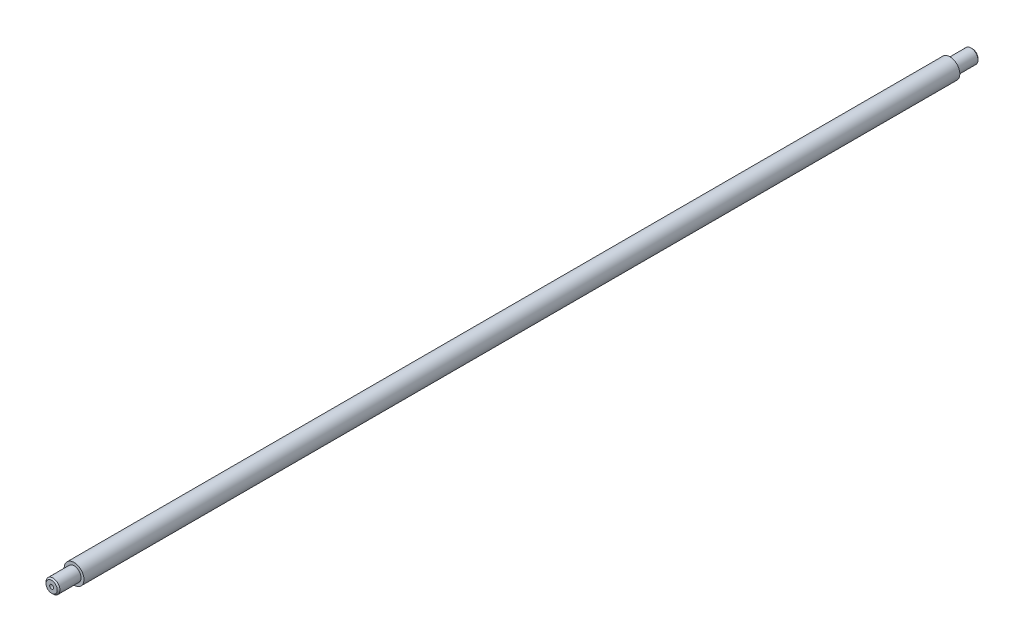
ISO-10303-21;
HEADER;
FILE_DESCRIPTION(('STEP AP214'),'2;1');
FILE_NAME('part.step','',(''),(''),'','','');
FILE_SCHEMA(('AUTOMOTIVE_DESIGN { 1 0 10303 214 1 1 1 1 }'));
ENDSEC;
DATA;
#1=APPLICATION_CONTEXT('core data for automotive mechanical design processes');
#2=APPLICATION_PROTOCOL_DEFINITION('international standard','automotive_design',2000,#1);
#3=PRODUCT_CONTEXT('',#1,'mechanical');
#4=PRODUCT('Part','Part','',(#3));
#5=PRODUCT_RELATED_PRODUCT_CATEGORY('part','',(#4));
#6=PRODUCT_DEFINITION_FORMATION('','',#4);
#7=PRODUCT_DEFINITION_CONTEXT('part definition',#1,'design');
#8=PRODUCT_DEFINITION('design','',#6,#7);
#9=PRODUCT_DEFINITION_SHAPE('','',#8);
#10=(LENGTH_UNIT() NAMED_UNIT(*) SI_UNIT(.MILLI.,.METRE.));
#11=(NAMED_UNIT(*) PLANE_ANGLE_UNIT() SI_UNIT($,.RADIAN.));
#12=(NAMED_UNIT(*) SI_UNIT($,.STERADIAN.) SOLID_ANGLE_UNIT());
#13=UNCERTAINTY_MEASURE_WITH_UNIT(LENGTH_MEASURE(1.E-05),#10,'distance_accuracy_value','');
#14=(GEOMETRIC_REPRESENTATION_CONTEXT(3) GLOBAL_UNCERTAINTY_ASSIGNED_CONTEXT((#13)) GLOBAL_UNIT_ASSIGNED_CONTEXT((#10,
#11,#12)) REPRESENTATION_CONTEXT('',''));
#15=CARTESIAN_POINT('',(0.,0.,0.));
#16=DIRECTION('',(0.,0.,1.));
#17=DIRECTION('',(1.,0.,0.));
#18=AXIS2_PLACEMENT_3D('',#15,#16,#17);
#19=CARTESIAN_POINT('',(0.,0.,247.65));
#20=DIRECTION('',(0.,0.,-1.));
#21=DIRECTION('',(-1.,0.,0.));
#22=AXIS2_PLACEMENT_3D('',#19,#20,#21);
#23=CYLINDRICAL_SURFACE('',#22,5.588);
#24=CARTESIAN_POINT('',(0.,0.,247.65));
#25=DIRECTION('',(0.,0.,1.));
#26=DIRECTION('',(1.,0.,0.));
#27=AXIS2_PLACEMENT_3D('',#24,#25,#26);
#28=CIRCLE('',#27,5.588);
#29=CARTESIAN_POINT('',(5.588,0.,247.65));
#30=VERTEX_POINT('',#29);
#31=EDGE_CURVE('E61',#30,#30,#28,.T.);
#32=ORIENTED_EDGE('',*,*,#31,.F.);
#33=EDGE_LOOP('',(#32));
#34=FACE_BOUND('',#33,.T.);
#35=CARTESIAN_POINT('',(0.,0.,-247.65));
#36=DIRECTION('',(0.,0.,1.));
#37=DIRECTION('',(1.,0.,0.));
#38=AXIS2_PLACEMENT_3D('',#35,#36,#37);
#39=CIRCLE('',#38,5.588);
#40=CARTESIAN_POINT('',(5.588,0.,-247.65));
#41=VERTEX_POINT('',#40);
#42=EDGE_CURVE('E58',#41,#41,#39,.T.);
#43=ORIENTED_EDGE('',*,*,#42,.T.);
#44=EDGE_LOOP('',(#43));
#45=FACE_BOUND('',#44,.T.);
#46=ADVANCED_FACE('F36',(#34,#45),#23,.T.);
#47=CARTESIAN_POINT('',(0.,0.,247.65));
#48=DIRECTION('',(0.,0.,1.));
#49=DIRECTION('',(1.,0.,0.));
#50=AXIS2_PLACEMENT_3D('',#47,#48,#49);
#51=PLANE('',#50);
#52=CARTESIAN_POINT('',(0.,0.,247.65));
#53=DIRECTION('',(0.,0.,1.));
#54=DIRECTION('',(1.,0.,0.));
#55=AXIS2_PLACEMENT_3D('',#52,#53,#54);
#56=CIRCLE('',#55,3.937);
#57=CARTESIAN_POINT('',(3.937,0.,247.65));
#58=VERTEX_POINT('',#57);
#59=EDGE_CURVE('E65',#58,#58,#56,.T.);
#60=ORIENTED_EDGE('',*,*,#59,.F.);
#61=EDGE_LOOP('',(#60));
#62=FACE_BOUND('',#61,.T.);
#63=ORIENTED_EDGE('',*,*,#31,.T.);
#64=EDGE_LOOP('',(#63));
#65=FACE_BOUND('',#64,.T.);
#66=ADVANCED_FACE('F107',(#62,#65),#51,.T.);
#67=CARTESIAN_POINT('',(0.,0.,-247.65));
#68=DIRECTION('',(0.,0.,1.));
#69=DIRECTION('',(1.,0.,0.));
#70=AXIS2_PLACEMENT_3D('',#67,#68,#69);
#71=PLANE('',#70);
#72=CARTESIAN_POINT('',(0.,0.,-247.65));
#73=DIRECTION('',(0.,0.,-1.));
#74=DIRECTION('',(-1.,0.,0.));
#75=AXIS2_PLACEMENT_3D('',#72,#73,#74);
#76=CIRCLE('',#75,3.937);
#77=CARTESIAN_POINT('',(-3.937,0.,-247.65));
#78=VERTEX_POINT('',#77);
#79=EDGE_CURVE('E57',#78,#78,#76,.T.);
#80=ORIENTED_EDGE('',*,*,#79,.F.);
#81=EDGE_LOOP('',(#80));
#82=FACE_BOUND('',#81,.T.);
#83=ORIENTED_EDGE('',*,*,#42,.F.);
#84=EDGE_LOOP('',(#83));
#85=FACE_BOUND('',#84,.T.);
#86=ADVANCED_FACE('F113',(#82,#85),#71,.F.);
#87=CARTESIAN_POINT('',(0.,0.,260.35));
#88=DIRECTION('',(0.,0.,-1.));
#89=DIRECTION('',(-1.,0.,0.));
#90=AXIS2_PLACEMENT_3D('',#87,#88,#89);
#91=CYLINDRICAL_SURFACE('',#90,3.937);
#92=CARTESIAN_POINT('',(0.,0.,259.588));
#93=DIRECTION('',(0.,0.,1.));
#94=DIRECTION('',(1.,0.,0.));
#95=AXIS2_PLACEMENT_3D('',#92,#93,#94);
#96=CIRCLE('',#95,3.937);
#97=CARTESIAN_POINT('',(3.937,0.,259.588));
#98=VERTEX_POINT('',#97);
#99=EDGE_CURVE('E10',#98,#98,#96,.F.);
#100=ORIENTED_EDGE('',*,*,#99,.T.);
#101=EDGE_LOOP('',(#100));
#102=FACE_BOUND('',#101,.T.);
#103=ORIENTED_EDGE('',*,*,#59,.T.);
#104=EDGE_LOOP('',(#103));
#105=FACE_BOUND('',#104,.T.);
#106=ADVANCED_FACE('F139',(#102,#105),#91,.T.);
#107=CARTESIAN_POINT('',(0.,0.,260.35));
#108=DIRECTION('',(0.,0.,1.));
#109=DIRECTION('',(1.,0.,0.));
#110=AXIS2_PLACEMENT_3D('',#107,#108,#109);
#111=PLANE('',#110);
#112=CARTESIAN_POINT('',(0.,0.,260.35));
#113=DIRECTION('',(0.,0.,1.));
#114=DIRECTION('',(1.,0.,0.));
#115=AXIS2_PLACEMENT_3D('',#112,#113,#114);
#116=CIRCLE('',#115,3.17500000000004);
#117=CARTESIAN_POINT('',(3.17500000000004,0.,260.35));
#118=VERTEX_POINT('',#117);
#119=EDGE_CURVE('E44',#118,#118,#116,.T.);
#120=ORIENTED_EDGE('',*,*,#119,.T.);
#121=EDGE_LOOP('',(#120));
#122=FACE_BOUND('',#121,.T.);
#123=CARTESIAN_POINT('',(0.,0.,260.35));
#124=DIRECTION('',(0.,0.,1.));
#125=DIRECTION('',(1.,0.,0.));
#126=AXIS2_PLACEMENT_3D('',#123,#124,#125);
#127=CIRCLE('',#126,1.143);
#128=CARTESIAN_POINT('',(1.143,0.,260.35));
#129=VERTEX_POINT('',#128);
#130=EDGE_CURVE('E70',#129,#129,#127,.T.);
#131=ORIENTED_EDGE('',*,*,#130,.F.);
#132=EDGE_LOOP('',(#131));
#133=FACE_BOUND('',#132,.T.);
#134=ADVANCED_FACE('F103',(#122,#133),#111,.T.);
#135=CARTESIAN_POINT('',(0.,0.,-260.35));
#136=DIRECTION('',(0.,0.,1.));
#137=DIRECTION('',(1.,0.,0.));
#138=AXIS2_PLACEMENT_3D('',#135,#136,#137);
#139=CYLINDRICAL_SURFACE('',#138,3.937);
#140=CARTESIAN_POINT('',(0.,0.,-259.588));
#141=DIRECTION('',(0.,0.,-1.));
#142=DIRECTION('',(-1.,0.,0.));
#143=AXIS2_PLACEMENT_3D('',#140,#141,#142);
#144=CIRCLE('',#143,3.937);
#145=CARTESIAN_POINT('',(-3.937,0.,-259.588));
#146=VERTEX_POINT('',#145);
#147=EDGE_CURVE('E48',#146,#146,#144,.F.);
#148=ORIENTED_EDGE('',*,*,#147,.T.);
#149=EDGE_LOOP('',(#148));
#150=FACE_BOUND('',#149,.T.);
#151=ORIENTED_EDGE('',*,*,#79,.T.);
#152=EDGE_LOOP('',(#151));
#153=FACE_BOUND('',#152,.T.);
#154=ADVANCED_FACE('F94',(#150,#153),#139,.T.);
#155=CARTESIAN_POINT('',(0.,0.,-260.35));
#156=DIRECTION('',(0.,0.,-1.));
#157=DIRECTION('',(-1.,0.,0.));
#158=AXIS2_PLACEMENT_3D('',#155,#156,#157);
#159=PLANE('',#158);
#160=CARTESIAN_POINT('',(0.,0.,-260.35));
#161=DIRECTION('',(0.,0.,-1.));
#162=DIRECTION('',(-1.,0.,0.));
#163=AXIS2_PLACEMENT_3D('',#160,#161,#162);
#164=CIRCLE('',#163,3.17500000000004);
#165=CARTESIAN_POINT('',(-3.17500000000004,0.,-260.35));
#166=VERTEX_POINT('',#165);
#167=EDGE_CURVE('E52',#166,#166,#164,.T.);
#168=ORIENTED_EDGE('',*,*,#167,.T.);
#169=EDGE_LOOP('',(#168));
#170=FACE_BOUND('',#169,.T.);
#171=CARTESIAN_POINT('',(0.,0.,-260.35));
#172=DIRECTION('',(0.,0.,-1.));
#173=DIRECTION('',(-1.,0.,0.));
#174=AXIS2_PLACEMENT_3D('',#171,#172,#173);
#175=CIRCLE('',#174,1.143);
#176=CARTESIAN_POINT('',(-1.143,0.,-260.35));
#177=VERTEX_POINT('',#176);
#178=EDGE_CURVE('E76',#177,#177,#175,.T.);
#179=ORIENTED_EDGE('',*,*,#178,.F.);
#180=EDGE_LOOP('',(#179));
#181=FACE_BOUND('',#180,.T.);
#182=ADVANCED_FACE('F91',(#170,#181),#159,.T.);
#183=CARTESIAN_POINT('',(0.,0.,234.95));
#184=DIRECTION('',(0.,0.,1.));
#185=DIRECTION('',(1.,0.,0.));
#186=AXIS2_PLACEMENT_3D('',#183,#184,#185);
#187=CYLINDRICAL_SURFACE('',#186,1.143);
#188=CARTESIAN_POINT('',(0.,0.,234.95));
#189=DIRECTION('',(0.,0.,1.));
#190=DIRECTION('',(1.,0.,0.));
#191=AXIS2_PLACEMENT_3D('',#188,#189,#190);
#192=CIRCLE('',#191,1.143);
#193=CARTESIAN_POINT('',(1.143,0.,234.95));
#194=VERTEX_POINT('',#193);
#195=EDGE_CURVE('E62',#194,#194,#192,.T.);
#196=ORIENTED_EDGE('',*,*,#195,.F.);
#197=EDGE_LOOP('',(#196));
#198=FACE_BOUND('',#197,.T.);
#199=ORIENTED_EDGE('',*,*,#130,.T.);
#200=EDGE_LOOP('',(#199));
#201=FACE_BOUND('',#200,.T.);
#202=ADVANCED_FACE('F93',(#198,#201),#187,.F.);
#203=CARTESIAN_POINT('',(0.,0.,234.95));
#204=DIRECTION('',(0.,0.,1.));
#205=DIRECTION('',(1.,0.,0.));
#206=AXIS2_PLACEMENT_3D('',#203,#204,#205);
#207=PLANE('',#206);
#208=ORIENTED_EDGE('',*,*,#195,.T.);
#209=EDGE_LOOP('',(#208));
#210=FACE_BOUND('',#209,.T.);
#211=ADVANCED_FACE('F87',(#210),#207,.T.);
#212=CARTESIAN_POINT('',(0.,0.,-234.95));
#213=DIRECTION('',(0.,0.,-1.));
#214=DIRECTION('',(-1.,0.,0.));
#215=AXIS2_PLACEMENT_3D('',#212,#213,#214);
#216=CYLINDRICAL_SURFACE('',#215,1.143);
#217=CARTESIAN_POINT('',(0.,0.,-234.95));
#218=DIRECTION('',(0.,0.,-1.));
#219=DIRECTION('',(-1.,0.,0.));
#220=AXIS2_PLACEMENT_3D('',#217,#218,#219);
#221=CIRCLE('',#220,1.143);
#222=CARTESIAN_POINT('',(-1.143,0.,-234.95));
#223=VERTEX_POINT('',#222);
#224=EDGE_CURVE('E73',#223,#223,#221,.T.);
#225=ORIENTED_EDGE('',*,*,#224,.F.);
#226=EDGE_LOOP('',(#225));
#227=FACE_BOUND('',#226,.T.);
#228=ORIENTED_EDGE('',*,*,#178,.T.);
#229=EDGE_LOOP('',(#228));
#230=FACE_BOUND('',#229,.T.);
#231=ADVANCED_FACE('F84',(#227,#230),#216,.F.);
#232=CARTESIAN_POINT('',(0.,0.,-234.95));
#233=DIRECTION('',(0.,0.,-1.));
#234=DIRECTION('',(-1.,0.,0.));
#235=AXIS2_PLACEMENT_3D('',#232,#233,#234);
#236=PLANE('',#235);
#237=ORIENTED_EDGE('',*,*,#224,.T.);
#238=EDGE_LOOP('',(#237));
#239=FACE_BOUND('',#238,.T.);
#240=ADVANCED_FACE('F82',(#239),#236,.T.);
#241=CARTESIAN_POINT('',(0.,0.,-260.35));
#242=DIRECTION('',(0.,0.,1.));
#243=DIRECTION('',(1.,0.,0.));
#244=AXIS2_PLACEMENT_3D('',#241,#242,#243);
#245=CONICAL_SURFACE('',#244,3.17500000000004,0.785398163397432);
#246=ORIENTED_EDGE('',*,*,#147,.F.);
#247=EDGE_LOOP('',(#246));
#248=FACE_BOUND('',#247,.T.);
#249=ORIENTED_EDGE('',*,*,#167,.F.);
#250=EDGE_LOOP('',(#249));
#251=FACE_BOUND('',#250,.T.);
#252=ADVANCED_FACE('F120',(#248,#251),#245,.T.);
#253=CARTESIAN_POINT('',(0.,0.,260.35));
#254=DIRECTION('',(0.,0.,-1.));
#255=DIRECTION('',(-1.,0.,0.));
#256=AXIS2_PLACEMENT_3D('',#253,#254,#255);
#257=CONICAL_SURFACE('',#256,3.17500000000004,0.785398163397432);
#258=ORIENTED_EDGE('',*,*,#99,.F.);
#259=EDGE_LOOP('',(#258));
#260=FACE_BOUND('',#259,.T.);
#261=ORIENTED_EDGE('',*,*,#119,.F.);
#262=EDGE_LOOP('',(#261));
#263=FACE_BOUND('',#262,.T.);
#264=ADVANCED_FACE('F39',(#260,#263),#257,.T.);
#265=CLOSED_SHELL('',(#46,#66,#86,#106,#134,#154,#182,#202,#211,#231,#240,#252,#264));
#266=MANIFOLD_SOLID_BREP('B2',#265);
#267=ADVANCED_BREP_SHAPE_REPRESENTATION('',(#18,#266),#14);
#268=SHAPE_DEFINITION_REPRESENTATION(#9,#267);
ENDSEC;
END-ISO-10303-21;
